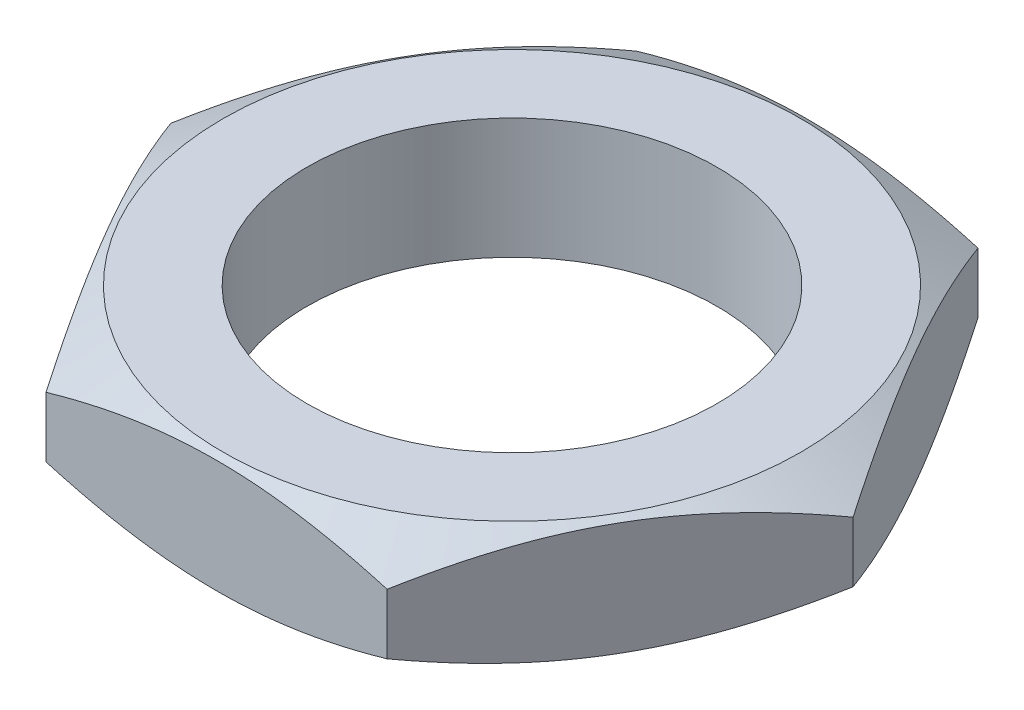
ISO-10303-21;
HEADER;
FILE_DESCRIPTION(('STEP AP214'),'2;1');
FILE_NAME('part.step','',(''),(''),'','','');
FILE_SCHEMA(('AUTOMOTIVE_DESIGN { 1 0 10303 214 1 1 1 1 }'));
ENDSEC;
DATA;
#1=APPLICATION_CONTEXT('core data for automotive mechanical design processes');
#2=APPLICATION_PROTOCOL_DEFINITION('international standard','automotive_design',2000,#1);
#3=PRODUCT_CONTEXT('',#1,'mechanical');
#4=PRODUCT('Part','Part','',(#3));
#5=PRODUCT_RELATED_PRODUCT_CATEGORY('part','',(#4));
#6=PRODUCT_DEFINITION_FORMATION('','',#4);
#7=PRODUCT_DEFINITION_CONTEXT('part definition',#1,'design');
#8=PRODUCT_DEFINITION('design','',#6,#7);
#9=PRODUCT_DEFINITION_SHAPE('','',#8);
#10=(LENGTH_UNIT() NAMED_UNIT(*) SI_UNIT(.MILLI.,.METRE.));
#11=(NAMED_UNIT(*) PLANE_ANGLE_UNIT() SI_UNIT($,.RADIAN.));
#12=(NAMED_UNIT(*) SI_UNIT($,.STERADIAN.) SOLID_ANGLE_UNIT());
#13=UNCERTAINTY_MEASURE_WITH_UNIT(LENGTH_MEASURE(1.E-05),#10,'distance_accuracy_value','');
#14=(GEOMETRIC_REPRESENTATION_CONTEXT(3) GLOBAL_UNCERTAINTY_ASSIGNED_CONTEXT((#13)) GLOBAL_UNIT_ASSIGNED_CONTEXT((#10,
#11,#12)) REPRESENTATION_CONTEXT('',''));
#15=CARTESIAN_POINT('',(0.,0.,0.));
#16=DIRECTION('',(0.,0.,1.));
#17=DIRECTION('',(1.,0.,0.));
#18=AXIS2_PLACEMENT_3D('',#15,#16,#17);
#19=CARTESIAN_POINT('',(0.,2.,0.));
#20=DIRECTION('',(0.,1.,0.));
#21=DIRECTION('',(0.,0.,1.));
#22=AXIS2_PLACEMENT_3D('',#19,#20,#21);
#23=PLANE('',#22);
#24=CARTESIAN_POINT('',(0.,2.,0.));
#25=DIRECTION('',(0.,1.,0.));
#26=DIRECTION('',(0.,0.,1.));
#27=AXIS2_PLACEMENT_3D('',#24,#25,#26);
#28=CIRCLE('',#27,3.4);
#29=CARTESIAN_POINT('',(0.,2.,3.4));
#30=VERTEX_POINT('',#29);
#31=EDGE_CURVE('E199',#30,#30,#28,.T.);
#32=ORIENTED_EDGE('',*,*,#31,.F.);
#33=EDGE_LOOP('',(#32));
#34=FACE_BOUND('',#33,.T.);
#35=CARTESIAN_POINT('',(0.,2.,0.));
#36=DIRECTION('',(0.,-1.,0.));
#37=DIRECTION('',(1.,0.,0.));
#38=AXIS2_PLACEMENT_3D('',#35,#36,#37);
#39=CIRCLE('',#38,4.79200723427386);
#40=CARTESIAN_POINT('',(4.79200723427391,2.00000000000002,0.));
#41=VERTEX_POINT('',#40);
#42=EDGE_CURVE('E221',#41,#41,#39,.T.);
#43=ORIENTED_EDGE('',*,*,#42,.F.);
#44=EDGE_LOOP('',(#43));
#45=FACE_BOUND('',#44,.T.);
#46=ADVANCED_FACE('F41',(#34,#45),#23,.T.);
#47=CARTESIAN_POINT('',(0.,0.,0.));
#48=DIRECTION('',(0.,1.,0.));
#49=DIRECTION('',(0.,0.,1.));
#50=AXIS2_PLACEMENT_3D('',#47,#48,#49);
#51=PLANE('',#50);
#52=CARTESIAN_POINT('',(0.,0.,0.));
#53=DIRECTION('',(0.,1.,0.));
#54=DIRECTION('',(0.,0.,1.));
#55=AXIS2_PLACEMENT_3D('',#52,#53,#54);
#56=CIRCLE('',#55,3.4);
#57=CARTESIAN_POINT('',(0.,0.,3.4));
#58=VERTEX_POINT('',#57);
#59=EDGE_CURVE('E198',#58,#58,#56,.T.);
#60=ORIENTED_EDGE('',*,*,#59,.T.);
#61=EDGE_LOOP('',(#60));
#62=FACE_BOUND('',#61,.T.);
#63=CARTESIAN_POINT('',(0.,0.,0.));
#64=DIRECTION('',(0.,-1.,0.));
#65=DIRECTION('',(1.,0.,0.));
#66=AXIS2_PLACEMENT_3D('',#63,#64,#65);
#67=CIRCLE('',#66,4.79200723427386);
#68=CARTESIAN_POINT('',(4.79200723427391,0.,0.));
#69=VERTEX_POINT('',#68);
#70=EDGE_CURVE('E225',#69,#69,#67,.T.);
#71=ORIENTED_EDGE('',*,*,#70,.T.);
#72=EDGE_LOOP('',(#71));
#73=FACE_BOUND('',#72,.T.);
#74=ADVANCED_FACE('F232',(#62,#73),#51,.F.);
#75=CARTESIAN_POINT('',(0.,2.,0.));
#76=DIRECTION('',(0.,-1.,0.));
#77=DIRECTION('',(0.,0.,-1.));
#78=AXIS2_PLACEMENT_3D('',#75,#76,#77);
#79=CYLINDRICAL_SURFACE('',#78,3.4);
#80=ORIENTED_EDGE('',*,*,#31,.T.);
#81=EDGE_LOOP('',(#80));
#82=FACE_BOUND('',#81,.T.);
#83=ORIENTED_EDGE('',*,*,#59,.F.);
#84=EDGE_LOOP('',(#83));
#85=FACE_BOUND('',#84,.T.);
#86=ADVANCED_FACE('F136',(#82,#85),#79,.F.);
#87=CARTESIAN_POINT('',(0.,0.499999999999945,0.));
#88=DIRECTION('',(0.,1.,0.));
#89=DIRECTION('',(-1.,0.,0.));
#90=AXIS2_PLACEMENT_3D('',#87,#88,#89);
#91=CONICAL_SURFACE('',#90,5.65803263805829,1.04719755119664);
#92=ORIENTED_EDGE('',*,*,#70,.F.);
#93=EDGE_LOOP('',(#92));
#94=FACE_BOUND('',#93,.T.);
#95=CARTESIAN_POINT('',(-8.50929847805935,2.90249437028564,4.90000000000009));
#96=CARTESIAN_POINT('',(-8.3056575233591,2.80062326429836,4.90000000000009));
#97=CARTESIAN_POINT('',(-8.10166143336671,2.69945462690032,4.90000000000008));
#98=CARTESIAN_POINT('',(-7.69279708503687,2.49886180214042,4.90000000000008));
#99=CARTESIAN_POINT('',(-7.48792876941672,2.39943773161803,4.90000000000008));
#100=CARTESIAN_POINT('',(-7.07677156335833,2.2024891002043,4.90000000000007));
#101=CARTESIAN_POINT('',(-6.87048064279863,2.1049687684786,4.90000000000007));
#102=CARTESIAN_POINT('',(-6.45670236813438,1.91250601420058,4.90000000000007));
#103=CARTESIAN_POINT('',(-6.24921503753413,1.81756354121223,4.90000000000007));
#104=CARTESIAN_POINT('',(-5.82343657037768,1.62664697676281,4.90000000000006));
#105=CARTESIAN_POINT('',(-5.60507970536397,1.53081898907332,4.90000000000006));
#106=CARTESIAN_POINT('',(-5.16650546915723,1.34352367776462,4.90000000000005));
#107=CARTESIAN_POINT('',(-4.94628816306703,1.25205620229502,4.90000000000005));
#108=CARTESIAN_POINT('',(-4.5037516917027,1.07470489275459,4.90000000000005));
#109=CARTESIAN_POINT('',(-4.28143382346245,0.988817841940205,4.90000000000005));
#110=CARTESIAN_POINT('',(-3.83420063309471,0.824129575926287,4.90000000000004));
#111=CARTESIAN_POINT('',(-3.60928559848315,0.745327584711642,4.90000000000004));
#112=CARTESIAN_POINT('',(-3.10342968689821,0.579390394495419,4.90000000000003));
#113=CARTESIAN_POINT('',(-2.82169998622153,0.494623454789728,4.90000000000003));
#114=CARTESIAN_POINT('',(-2.25315988093209,0.343704497905251,4.90000000000002));
#115=CARTESIAN_POINT('',(-1.9663499307873,0.277550824475047,4.90000000000002));
#116=CARTESIAN_POINT('',(-1.53518370342896,0.196928754869076,4.90000000000002));
#117=CARTESIAN_POINT('',(-1.39252811734528,0.173281527269368,4.90000000000002));
#118=CARTESIAN_POINT('',(-1.10630255219622,0.132453407262294,4.90000000000001));
#119=CARTESIAN_POINT('',(-0.962732708361694,0.115271580135958,4.90000000000001));
#120=CARTESIAN_POINT('',(-0.674965509769012,0.0878880755714065,4.90000000000001));
#121=CARTESIAN_POINT('',(-0.530768348406227,0.0776843817789623,4.90000000000001));
#122=CARTESIAN_POINT('',(-0.242039489102777,0.0645801081327594,4.9));
#123=CARTESIAN_POINT('',(-0.097507792588108,0.0616794972059309,4.9));
#124=CARTESIAN_POINT('',(0.192384920001188,0.06328493803544,4.9));
#125=CARTESIAN_POINT('',(0.337745687682987,0.0678357075999943,4.9));
#126=CARTESIAN_POINT('',(0.628047770239802,0.084273099695362,4.89999999999999));
#127=CARTESIAN_POINT('',(0.772989083248567,0.0961597548149582,4.89999999999999));
#128=CARTESIAN_POINT('',(1.06218179056766,0.126890386421764,4.89999999999999));
#129=CARTESIAN_POINT('',(1.20643290282158,0.145736995921202,4.89999999999999));
#130=CARTESIAN_POINT('',(1.49394518566744,0.189831947999736,4.89999999999999));
#131=CARTESIAN_POINT('',(1.63720632144198,0.215080514569869,4.89999999999998));
#132=CARTESIAN_POINT('',(2.07009477646272,0.300411853745416,4.89999999999998));
#133=CARTESIAN_POINT('',(2.35795556770022,0.369525417877549,4.89999999999998));
#134=CARTESIAN_POINT('',(2.9287007827471,0.525949721107696,4.89999999999997));
#135=CARTESIAN_POINT('',(3.21158230533385,0.613270711626837,4.89999999999997));
#136=CARTESIAN_POINT('',(3.71343353514693,0.781441814724652,4.89999999999996));
#137=CARTESIAN_POINT('',(3.9332663401682,0.85975427645491,4.89999999999996));
#138=CARTESIAN_POINT('',(4.37041278301648,1.02291056956414,4.89999999999996));
#139=CARTESIAN_POINT('',(4.5877270959115,1.10775260184943,4.89999999999995));
#140=CARTESIAN_POINT('',(5.02041296215908,1.282641205255,4.89999999999995));
#141=CARTESIAN_POINT('',(5.23578307857861,1.37269131115054,4.89999999999995));
#142=CARTESIAN_POINT('',(5.66477117180436,1.5568764137666,4.89999999999994));
#143=CARTESIAN_POINT('',(5.87838909287801,1.65101153982602,4.89999999999994));
#144=CARTESIAN_POINT('',(6.29514554365339,1.83849489924527,4.89999999999994));
#145=CARTESIAN_POINT('',(6.49834508088663,1.931707939353,4.89999999999993));
#146=CARTESIAN_POINT('',(6.9036004573576,2.12057545602201,4.89999999999993));
#147=CARTESIAN_POINT('',(7.10565631429502,2.21622989467312,4.89999999999993));
#148=CARTESIAN_POINT('',(7.50844571691837,2.4093733671581,4.89999999999992));
#149=CARTESIAN_POINT('',(7.70918097453281,2.50685883807706,4.89999999999992));
#150=CARTESIAN_POINT('',(8.10982411646701,2.7035024454122,4.89999999999992));
#151=CARTESIAN_POINT('',(8.30973202373609,2.80266053504018,4.89999999999991));
#152=CARTESIAN_POINT('',(8.50929847805945,2.90249437028565,4.89999999999991));
#153=B_SPLINE_CURVE_WITH_KNOTS('',3,(#95,#96,#97,#98,#99,#100,#101,#102,#103,#104,#105,#106,
#107,#108,#109,#110,#111,#112,#113,#114,#115,#116,#117,#118,#119,#120,#121,#122,#123,#124,#125,
#126,#127,#128,#129,#130,#131,#132,#133,#134,#135,#136,#137,#138,#139,#140,#141,#142,#143,#144,
#145,#146,#147,#148,#149,#150,#151,#152),.UNSPECIFIED.,.F.,.F.,(4,2,2,2,2,2,2,2,2,2,2,2,2,2,2,2,
2,2,2,2,2,2,2,2,2,2,2,2,4),(0.,0.683104072755931,1.36625372198822,2.05077931472942,
2.73529150500277,3.45063115840994,4.16594588261959,4.88084454878498,5.59566481762518,
6.47783684131721,7.35993034246223,7.79361357563099,8.22723408602896,8.66072924737596,
9.0942225642898,9.53032694279833,9.96643325866168,10.4027047266899,10.8389914610476,
11.7262258972984,12.6139612331911,13.3139353835799,14.0137173557322,14.7139799818105,
15.4142647956339,16.084923290998,16.7555713786693,17.4250274815205,18.0944648886146),.UNSPECIFIED.);
#154=CARTESIAN_POINT('',(-2.82901631902898,0.499999999999935,4.90000000000003));
#155=VERTEX_POINT('',#154);
#156=CARTESIAN_POINT('',(2.82901631902923,0.499999999999968,4.89999999999997));
#157=VERTEX_POINT('',#156);
#158=EDGE_CURVE('E56',#155,#157,#153,.T.);
#159=ORIENTED_EDGE('',*,*,#158,.F.);
#160=CARTESIAN_POINT('',(-5.65814810811218,0.500066668707423,-0.000199999999960545));
#161=CARTESIAN_POINT('',(-5.53382151838374,0.428269712536326,0.21513997014145));
#162=CARTESIAN_POINT('',(-5.40843156034933,0.362967055415012,0.432321748215975));
#163=CARTESIAN_POINT('',(-5.15548040936942,0.248980729712255,0.870445993546193));
#164=CARTESIAN_POINT('',(-5.02791472217963,0.20033738249348,1.09139624506135));
#165=CARTESIAN_POINT('',(-4.77434484352878,0.124630151443168,1.53059215815369));
#166=CARTESIAN_POINT('',(-4.64838014169528,0.0970619943998238,1.74876942168957));
#167=CARTESIAN_POINT('',(-4.45898998945309,0.072340869147508,2.07680278782624));
#168=CARTESIAN_POINT('',(-4.39581673421985,0.0668709779160111,2.18622207556972));
#169=CARTESIAN_POINT('',(-4.26941184065854,0.061567846662413,2.40516177354324));
#170=CARTESIAN_POINT('',(-4.20618020419414,0.0617344325358054,2.51468218054532));
#171=CARTESIAN_POINT('',(-4.03294288257485,0.0699480496401164,2.81473802335708));
#172=CARTESIAN_POINT('',(-3.92299459953095,0.0837426447185814,3.00517403579407));
#173=CARTESIAN_POINT('',(-3.70382774946254,0.127485480307362,3.38478215544738));
#174=CARTESIAN_POINT('',(-3.59460995281296,0.157448673828991,3.57395292833517));
#175=CARTESIAN_POINT('',(-3.37500152879443,0.232348992284918,3.95432587650538));
#176=CARTESIAN_POINT('',(-3.26463861791819,0.277603498259,4.14548004541422));
#177=CARTESIAN_POINT('',(-3.04555871027542,0.380313230199797,4.524937576369));
#178=CARTESIAN_POINT('',(-2.93683890736622,0.437744326847631,4.7132457987966));
#179=CARTESIAN_POINT('',(-2.82890084897528,0.500066668707418,4.90020000000003));
#180=B_SPLINE_CURVE_WITH_KNOTS('',3,(#160,#161,#162,#163,#164,#165,#166,#167,#168,#169,#170,
#171,#172,#173,#174,#175,#176,#177,#178,#179),.UNSPECIFIED.,.F.,.F.,(4,2,2,2,2,2,2,2,2,4),(0.,
0.77670504079433,1.55527690970039,2.31457999459248,2.69386501409238,3.07313831791074,
3.73343440743842,4.39434219988734,5.06990891293315,5.74414921983021),.UNSPECIFIED.);
#181=CARTESIAN_POINT('',(-5.65803263805824,0.499999999999926,2.09467859724199E-13));
#182=VERTEX_POINT('',#181);
#183=EDGE_CURVE('E145',#182,#155,#180,.T.);
#184=ORIENTED_EDGE('',*,*,#183,.F.);
#185=CARTESIAN_POINT('',(-2.82890084897535,0.500066668707419,-4.90019999999999));
#186=CARTESIAN_POINT('',(-2.95322743870378,0.428269712536321,-4.68486002985858));
#187=CARTESIAN_POINT('',(-3.07861739673819,0.362967055415008,-4.46767825178405));
#188=CARTESIAN_POINT('',(-3.33156854771809,0.248980729712252,-4.02955400645383));
#189=CARTESIAN_POINT('',(-3.45913423490788,0.200337382493478,-3.80860375493868));
#190=CARTESIAN_POINT('',(-3.71270411355872,0.124630151443167,-3.36940784184634));
#191=CARTESIAN_POINT('',(-3.83866881539222,0.0970619943998222,-3.15123057831045));
#192=CARTESIAN_POINT('',(-4.0280589676344,0.0723408691475071,-2.82319721217378));
#193=CARTESIAN_POINT('',(-4.09123222286764,0.0668709779160107,-2.7137779244303));
#194=CARTESIAN_POINT('',(-4.21763711642894,0.0615678466624131,-2.49483822645678));
#195=CARTESIAN_POINT('',(-4.28086875289335,0.0617344325358056,-2.3853178194547));
#196=CARTESIAN_POINT('',(-4.45410607451264,0.0699480496401172,-2.08526197664294));
#197=CARTESIAN_POINT('',(-4.56405435755653,0.083742644718583,-1.89482596420595));
#198=CARTESIAN_POINT('',(-4.78322120762494,0.127485480307364,-1.51521784455263));
#199=CARTESIAN_POINT('',(-4.89243900427451,0.157448673828993,-1.32604707166484));
#200=CARTESIAN_POINT('',(-5.11204742829304,0.23234899228492,-0.945674123494625));
#201=CARTESIAN_POINT('',(-5.22241033916927,0.277603498259003,-0.754519954585786));
#202=CARTESIAN_POINT('',(-5.44149024681205,0.380313230199801,-0.375062423630999));
#203=CARTESIAN_POINT('',(-5.55021004972124,0.437744326847635,-0.186754201203398));
#204=CARTESIAN_POINT('',(-5.65814810811217,0.500066668707423,0.000200000000039495));
#205=B_SPLINE_CURVE_WITH_KNOTS('',3,(#185,#186,#187,#188,#189,#190,#191,#192,#193,#194,#195,
#196,#197,#198,#199,#200,#201,#202,#203,#204),.UNSPECIFIED.,.F.,.F.,(4,2,2,2,2,2,2,2,2,4),(0.,
0.776705040794326,1.55527690970038,2.31457999459248,2.69386501409237,3.07313831791072,
3.73343440743841,4.39434219988734,5.06990891293315,5.74414921983021),.UNSPECIFIED.);
#206=CARTESIAN_POINT('',(-2.82901631902926,0.499999999999935,-4.89999999999986));
#207=VERTEX_POINT('',#206);
#208=EDGE_CURVE('E153',#207,#182,#205,.T.);
#209=ORIENTED_EDGE('',*,*,#208,.F.);
#210=CARTESIAN_POINT('',(8.50929847805938,2.90249437028565,-4.90000000000003));
#211=CARTESIAN_POINT('',(8.30565752335914,2.80062326429837,-4.90000000000003));
#212=CARTESIAN_POINT('',(8.10166143336675,2.69945462690033,-4.90000000000003));
#213=CARTESIAN_POINT('',(7.69279708503691,2.49886180214043,-4.90000000000003));
#214=CARTESIAN_POINT('',(7.48792876941676,2.39943773161804,-4.90000000000003));
#215=CARTESIAN_POINT('',(7.07677156335838,2.20248910020431,-4.90000000000003));
#216=CARTESIAN_POINT('',(6.87048064279868,2.10496876847861,-4.90000000000003));
#217=CARTESIAN_POINT('',(6.45670236813443,1.91250601420059,-4.90000000000002));
#218=CARTESIAN_POINT('',(6.24921503753418,1.81756354121225,-4.90000000000002));
#219=CARTESIAN_POINT('',(5.82343657037774,1.62664697676282,-4.90000000000002));
#220=CARTESIAN_POINT('',(5.60507970536403,1.53081898907333,-4.90000000000002));
#221=CARTESIAN_POINT('',(5.1665054691573,1.34352367776463,-4.90000000000002));
#222=CARTESIAN_POINT('',(4.9462881630671,1.25205620229503,-4.90000000000002));
#223=CARTESIAN_POINT('',(4.50375169170277,1.0747048927546,-4.90000000000002));
#224=CARTESIAN_POINT('',(4.28143382346253,0.988817841940215,-4.90000000000002));
#225=CARTESIAN_POINT('',(3.83420063309479,0.824129575926295,-4.90000000000001));
#226=CARTESIAN_POINT('',(3.60928559848323,0.745327584711651,-4.90000000000001));
#227=CARTESIAN_POINT('',(3.1034296868983,0.579390394495426,-4.90000000000001));
#228=CARTESIAN_POINT('',(2.82169998622161,0.494623454789734,-4.90000000000001));
#229=CARTESIAN_POINT('',(2.25315988093218,0.343704497905256,-4.90000000000001));
#230=CARTESIAN_POINT('',(1.96634993078739,0.277550824475052,-4.90000000000001));
#231=CARTESIAN_POINT('',(1.53518370342906,0.19692875486908,-4.90000000000001));
#232=CARTESIAN_POINT('',(1.39252811734538,0.173281527269372,-4.90000000000001));
#233=CARTESIAN_POINT('',(1.10630255219632,0.132453407262297,-4.9));
#234=CARTESIAN_POINT('',(0.962732708361791,0.115271580135961,-4.9));
#235=CARTESIAN_POINT('',(0.674965509769109,0.0878880755714087,-4.9));
#236=CARTESIAN_POINT('',(0.530768348406324,0.0776843817789642,-4.9));
#237=CARTESIAN_POINT('',(0.242039489102876,0.0645801081327607,-4.9));
#238=CARTESIAN_POINT('',(0.0975077925882073,0.0616794972059317,-4.9));
#239=CARTESIAN_POINT('',(-0.192384920001088,0.06328493803544,-4.9));
#240=CARTESIAN_POINT('',(-0.337745687682886,0.0678357075999939,-4.9));
#241=CARTESIAN_POINT('',(-0.628047770239699,0.0842730996953606,-4.9));
#242=CARTESIAN_POINT('',(-0.772989083248464,0.0961597548149561,-4.9));
#243=CARTESIAN_POINT('',(-1.06218179056755,0.126890386421761,-4.9));
#244=CARTESIAN_POINT('',(-1.20643290282147,0.145736995921199,-4.9));
#245=CARTESIAN_POINT('',(-1.49394518566733,0.189831947999732,-4.9));
#246=CARTESIAN_POINT('',(-1.63720632144187,0.215080514569864,-4.9));
#247=CARTESIAN_POINT('',(-2.07009477646262,0.300411853745408,-4.9));
#248=CARTESIAN_POINT('',(-2.35795556770011,0.369525417877539,-4.89999999999999));
#249=CARTESIAN_POINT('',(-2.92870078274699,0.525949721107683,-4.89999999999999));
#250=CARTESIAN_POINT('',(-3.21158230533374,0.613270711626822,-4.89999999999999));
#251=CARTESIAN_POINT('',(-3.71343353514682,0.781441814724634,-4.89999999999999));
#252=CARTESIAN_POINT('',(-3.93326634016809,0.859754276454892,-4.89999999999999));
#253=CARTESIAN_POINT('',(-4.37041278301638,1.02291056956412,-4.89999999999999));
#254=CARTESIAN_POINT('',(-4.5877270959114,1.10775260184942,-4.89999999999999));
#255=CARTESIAN_POINT('',(-5.02041296215899,1.28264120525498,-4.89999999999998));
#256=CARTESIAN_POINT('',(-5.23578307857852,1.37269131115053,-4.89999999999998));
#257=CARTESIAN_POINT('',(-5.66477117180428,1.55687641376658,-4.89999999999998));
#258=CARTESIAN_POINT('',(-5.87838909287793,1.651011539826,-4.89999999999998));
#259=CARTESIAN_POINT('',(-6.29514554365332,1.83849489924525,-4.89999999999998));
#260=CARTESIAN_POINT('',(-6.49834508088656,1.93170793935298,-4.89999999999998));
#261=CARTESIAN_POINT('',(-6.90360045735754,2.12057545602199,-4.89999999999998));
#262=CARTESIAN_POINT('',(-7.10565631429496,2.21622989467311,-4.89999999999998));
#263=CARTESIAN_POINT('',(-7.50844571691832,2.40937336715809,-4.89999999999998));
#264=CARTESIAN_POINT('',(-7.70918097453276,2.50685883807704,-4.89999999999998));
#265=CARTESIAN_POINT('',(-8.10982411646697,2.70350244541218,-4.89999999999997));
#266=CARTESIAN_POINT('',(-8.30973202373605,2.80266053504017,-4.89999999999997));
#267=CARTESIAN_POINT('',(-8.50929847805942,2.90249437028564,-4.89999999999997));
#268=B_SPLINE_CURVE_WITH_KNOTS('',3,(#210,#211,#212,#213,#214,#215,#216,#217,#218,#219,#220,
#221,#222,#223,#224,#225,#226,#227,#228,#229,#230,#231,#232,#233,#234,#235,#236,#237,#238,#239,
#240,#241,#242,#243,#244,#245,#246,#247,#248,#249,#250,#251,#252,#253,#254,#255,#256,#257,#258,
#259,#260,#261,#262,#263,#264,#265,#266,#267),.UNSPECIFIED.,.F.,.F.,(4,2,2,2,2,2,2,2,2,2,2,2,2,
2,2,2,2,2,2,2,2,2,2,2,2,2,2,2,4),(0.,0.683104072755927,1.36625372198821,2.05077931472941,
2.73529150500275,3.45063115840991,4.16594588261956,4.88084454878493,5.59566481762514,
6.47783684131716,7.35993034246217,7.79361357563093,8.22723408602891,8.6607292473759,
9.09422256428974,9.53032694279827,9.96643325866162,10.4027047266898,10.8389914610475,
11.7262258972983,12.6139612331911,13.3139353835798,14.0137173557321,14.7139799818105,
15.4142647956339,16.084923290998,16.7555713786693,17.4250274815205,18.0944648886146),.UNSPECIFIED.);
#269=CARTESIAN_POINT('',(2.82901631902911,0.499999999999955,-4.90000000000001));
#270=VERTEX_POINT('',#269);
#271=EDGE_CURVE('E101',#270,#207,#268,.T.);
#272=ORIENTED_EDGE('',*,*,#271,.F.);
#273=CARTESIAN_POINT('',(5.65814810811218,0.500066668707406,0.000200000000000053));
#274=CARTESIAN_POINT('',(5.53382151838375,0.428269712536307,-0.215139970141408));
#275=CARTESIAN_POINT('',(5.40843156034934,0.362967055414994,-0.43232174821593));
#276=CARTESIAN_POINT('',(5.15548040936944,0.248980729712237,-0.870445993546141));
#277=CARTESIAN_POINT('',(5.02791472217965,0.200337382493463,-1.09139624506129));
#278=CARTESIAN_POINT('',(4.77434484352881,0.12463015144315,-1.53059215815363));
#279=CARTESIAN_POINT('',(4.64838014169531,0.0970619943998039,-1.74876942168951));
#280=CARTESIAN_POINT('',(4.45898998945313,0.0723408691474874,-2.07680278782618));
#281=CARTESIAN_POINT('',(4.39581673421989,0.0668709779159907,-2.18622207556965));
#282=CARTESIAN_POINT('',(4.26941184065859,0.0615678466623921,-2.40516177354317));
#283=CARTESIAN_POINT('',(4.20618020419418,0.0617344325357839,-2.51468218054525));
#284=CARTESIAN_POINT('',(4.03294288257489,0.0699480496400936,-2.814738023357));
#285=CARTESIAN_POINT('',(3.92299459953099,0.0837426447185585,-3.005174035794));
#286=CARTESIAN_POINT('',(3.70382774946258,0.12748548030734,-3.38478215544732));
#287=CARTESIAN_POINT('',(3.594609952813,0.15744867382897,-3.57395292833512));
#288=CARTESIAN_POINT('',(3.37500152879447,0.2323489922849,-3.95432587650533));
#289=CARTESIAN_POINT('',(3.26463861791823,0.277603498258983,-4.14548004541418));
#290=CARTESIAN_POINT('',(3.04555871027545,0.380313230199783,-4.52493757636897));
#291=CARTESIAN_POINT('',(2.93683890736626,0.437744326847619,-4.71324579879657));
#292=CARTESIAN_POINT('',(2.82890084897532,0.50006666870741,-4.90020000000001));
#293=B_SPLINE_CURVE_WITH_KNOTS('',3,(#273,#274,#275,#276,#277,#278,#279,#280,#281,#282,#283,
#284,#285,#286,#287,#288,#289,#290,#291,#292),.UNSPECIFIED.,.F.,.F.,(4,2,2,2,2,2,2,2,2,4),(0.,
0.776705040794316,1.55527690970036,2.31457999459244,2.69386501409234,3.07313831791068,
3.73343440743838,4.39434219988731,5.06990891293314,5.74414921983022),.UNSPECIFIED.);
#294=CARTESIAN_POINT('',(5.65803263805834,0.499999999999964,0.));
#295=VERTEX_POINT('',#294);
#296=EDGE_CURVE('E98',#295,#270,#293,.T.);
#297=ORIENTED_EDGE('',*,*,#296,.F.);
#298=CARTESIAN_POINT('',(2.82890084897539,0.50006666870741,4.90019999999997));
#299=CARTESIAN_POINT('',(2.95322743870382,0.428269712536312,4.68486002985856));
#300=CARTESIAN_POINT('',(3.07861739673822,0.362967055414999,4.46767825178404));
#301=CARTESIAN_POINT('',(3.33156854771812,0.248980729712243,4.02955400645382));
#302=CARTESIAN_POINT('',(3.45913423490791,0.200337382493469,3.80860375493867));
#303=CARTESIAN_POINT('',(3.71270411355875,0.124630151443158,3.36940784184633));
#304=CARTESIAN_POINT('',(3.83866881539225,0.0970619943998129,3.15123057831045));
#305=CARTESIAN_POINT('',(4.02805896763443,0.0723408691474974,2.82319721217378));
#306=CARTESIAN_POINT('',(4.09123222286766,0.0668709779160008,2.7137779244303));
#307=CARTESIAN_POINT('',(4.21763711642896,0.0615678466624029,2.49483822645678));
#308=CARTESIAN_POINT('',(4.28086875289337,0.0617344325357953,2.3853178194547));
#309=CARTESIAN_POINT('',(4.45410607451266,0.069948049640106,2.08526197664295));
#310=CARTESIAN_POINT('',(4.56405435755655,0.0837426447185706,1.89482596420596));
#311=CARTESIAN_POINT('',(4.78322120762495,0.127485480307351,1.51521784455265));
#312=CARTESIAN_POINT('',(4.89243900427453,0.15744867382898,1.32604707166486));
#313=CARTESIAN_POINT('',(5.11204742829305,0.232348992284907,0.94567412349465));
#314=CARTESIAN_POINT('',(5.22241033916928,0.277603498258988,0.754519954585814));
#315=CARTESIAN_POINT('',(5.44149024681205,0.380313230199784,0.375062423631032));
#316=CARTESIAN_POINT('',(5.55021004972124,0.437744326847618,0.186754201203435));
#317=CARTESIAN_POINT('',(5.65814810811218,0.500066668707405,-0.000199999999999379));
#318=B_SPLINE_CURVE_WITH_KNOTS('',3,(#298,#299,#300,#301,#302,#303,#304,#305,#306,#307,#308,
#309,#310,#311,#312,#313,#314,#315,#316,#317),.UNSPECIFIED.,.F.,.F.,(4,2,2,2,2,2,2,2,2,4),(0.,
0.776705040794319,1.55527690970037,2.31457999459245,2.69386501409235,3.0731383179107,
3.73343440743837,4.39434219988729,5.06990891293309,5.74414921983014),.UNSPECIFIED.);
#319=EDGE_CURVE('E70',#157,#295,#318,.T.);
#320=ORIENTED_EDGE('',*,*,#319,.F.);
#321=EDGE_LOOP('',(#159,#184,#209,#272,#297,#320));
#322=FACE_BOUND('',#321,.T.);
#323=ADVANCED_FACE('F99',(#94,#322),#91,.T.);
#324=CARTESIAN_POINT('',(0.,2.,0.));
#325=DIRECTION('',(0.,-1.,0.));
#326=DIRECTION('',(1.,0.,0.));
#327=AXIS2_PLACEMENT_3D('',#324,#325,#326);
#328=CONICAL_SURFACE('',#327,4.79200723427386,1.04719755119664);
#329=ORIENTED_EDGE('',*,*,#42,.T.);
#330=EDGE_LOOP('',(#329));
#331=FACE_BOUND('',#330,.T.);
#332=CARTESIAN_POINT('',(2.82890084897532,1.49993333129261,-4.90020000000001));
#333=CARTESIAN_POINT('',(2.95322743870375,1.57173028746371,-4.6848600298586));
#334=CARTESIAN_POINT('',(3.07861739673816,1.63703294458503,-4.46767825178408));
#335=CARTESIAN_POINT('',(3.33156854771806,1.75101927028779,-4.02955400645387));
#336=CARTESIAN_POINT('',(3.45913423490785,1.79966261750656,-3.80860375493871));
#337=CARTESIAN_POINT('',(3.71270411355869,1.87536984855688,-3.36940784184638));
#338=CARTESIAN_POINT('',(3.83866881539219,1.90293800560022,-3.1512305783105));
#339=CARTESIAN_POINT('',(4.02805896763437,1.92765913085254,-2.82319721217383));
#340=CARTESIAN_POINT('',(4.09123222286761,1.93312902208404,-2.71377792443035));
#341=CARTESIAN_POINT('',(4.21763711642891,1.93843215333764,-2.49483822645683));
#342=CARTESIAN_POINT('',(4.28086875289332,1.93826556746425,-2.38531781945475));
#343=CARTESIAN_POINT('',(4.45410607451261,1.93005195035994,-2.08526197664299));
#344=CARTESIAN_POINT('',(4.56405435755651,1.91625735528148,-1.894825964206));
#345=CARTESIAN_POINT('',(4.78322120762492,1.8725145196927,-1.51521784455268));
#346=CARTESIAN_POINT('',(4.8924390042745,1.84255132617107,-1.32604707166489));
#347=CARTESIAN_POINT('',(5.11204742829302,1.76765100771514,-0.945674123494672));
#348=CARTESIAN_POINT('',(5.22241033916926,1.72239650174106,-0.754519954585831));
#349=CARTESIAN_POINT('',(5.44149024681204,1.61968676980026,-0.375062423631041));
#350=CARTESIAN_POINT('',(5.55021004972124,1.56225567315242,-0.186754201203439));
#351=CARTESIAN_POINT('',(5.65814810811218,1.49993333129263,0.000199999999999985));
#352=B_SPLINE_CURVE_WITH_KNOTS('',3,(#332,#333,#334,#335,#336,#337,#338,#339,#340,#341,#342,
#343,#344,#345,#346,#347,#348,#349,#350,#351),.UNSPECIFIED.,.F.,.F.,(4,2,2,2,2,2,2,2,2,4),(0.,
0.776705040794319,1.55527690970037,2.31457999459246,2.69386501409235,3.0731383179107,
3.73343440743839,4.39434219988732,5.06990891293315,5.74414921983022),.UNSPECIFIED.);
#353=CARTESIAN_POINT('',(2.82901631902911,1.50000000000007,-4.90000000000001));
#354=VERTEX_POINT('',#353);
#355=CARTESIAN_POINT('',(5.65803263805834,1.50000000000008,0.));
#356=VERTEX_POINT('',#355);
#357=EDGE_CURVE('E117',#354,#356,#352,.T.);
#358=ORIENTED_EDGE('',*,*,#357,.F.);
#359=CARTESIAN_POINT('',(-8.50929847805941,-0.902494370285708,-4.89999999999997));
#360=CARTESIAN_POINT('',(-8.30565752335917,-0.800623264298427,-4.89999999999997));
#361=CARTESIAN_POINT('',(-8.10166143336678,-0.699454626900385,-4.89999999999997));
#362=CARTESIAN_POINT('',(-7.69279708503694,-0.498861802140479,-4.89999999999998));
#363=CARTESIAN_POINT('',(-7.48792876941679,-0.399437731618094,-4.89999999999998));
#364=CARTESIAN_POINT('',(-7.07677156335841,-0.20248910020436,-4.89999999999998));
#365=CARTESIAN_POINT('',(-6.87048064279871,-0.104968768478655,-4.89999999999998));
#366=CARTESIAN_POINT('',(-6.45670236813446,0.0874939857993655,-4.89999999999998));
#367=CARTESIAN_POINT('',(-6.24921503753421,0.182436458787713,-4.89999999999998));
#368=CARTESIAN_POINT('',(-5.82343657037776,0.373353023237137,-4.89999999999998));
#369=CARTESIAN_POINT('',(-5.60507970536405,0.46918101092663,-4.89999999999998));
#370=CARTESIAN_POINT('',(-5.16650546915732,0.656476322235336,-4.89999999999998));
#371=CARTESIAN_POINT('',(-4.94628816306712,0.747943797704936,-4.89999999999999));
#372=CARTESIAN_POINT('',(-4.50375169170279,0.925295107245368,-4.89999999999999));
#373=CARTESIAN_POINT('',(-4.28143382346255,1.01118215805976,-4.89999999999999));
#374=CARTESIAN_POINT('',(-3.83420063309481,1.17587042407368,-4.89999999999999));
#375=CARTESIAN_POINT('',(-3.60928559848324,1.25467241528833,-4.89999999999999));
#376=CARTESIAN_POINT('',(-3.10342968689831,1.42060960550455,-4.89999999999999));
#377=CARTESIAN_POINT('',(-2.82169998622163,1.50537654521025,-4.89999999999999));
#378=CARTESIAN_POINT('',(-2.25315988093219,1.65629550209473,-4.89999999999999));
#379=CARTESIAN_POINT('',(-1.9663499307874,1.72244917552494,-4.9));
#380=CARTESIAN_POINT('',(-1.53518370342907,1.80307124513091,-4.9));
#381=CARTESIAN_POINT('',(-1.39252811734539,1.82671847273062,-4.9));
#382=CARTESIAN_POINT('',(-1.10630255219633,1.8675465927377,-4.9));
#383=CARTESIAN_POINT('',(-0.962732708361805,1.88472841986404,-4.9));
#384=CARTESIAN_POINT('',(-0.674965509769123,1.91211192442859,-4.9));
#385=CARTESIAN_POINT('',(-0.530768348406338,1.92231561822104,-4.9));
#386=CARTESIAN_POINT('',(-0.24203948910289,1.93541989186724,-4.9));
#387=CARTESIAN_POINT('',(-0.0975077925882216,1.93832050279407,-4.9));
#388=CARTESIAN_POINT('',(0.192384920001073,1.93671506196457,-4.9));
#389=CARTESIAN_POINT('',(0.337745687682871,1.93216429240001,-4.9));
#390=CARTESIAN_POINT('',(0.628047770239685,1.91572690030465,-4.9));
#391=CARTESIAN_POINT('',(0.77298908324845,1.90384024518506,-4.9));
#392=CARTESIAN_POINT('',(1.06218179056754,1.87310961357825,-4.9));
#393=CARTESIAN_POINT('',(1.20643290282146,1.85426300407882,-4.90000000000001));
#394=CARTESIAN_POINT('',(1.49394518566732,1.81016805200029,-4.90000000000001));
#395=CARTESIAN_POINT('',(1.63720632144186,1.78491948543015,-4.90000000000001));
#396=CARTESIAN_POINT('',(2.07009477646261,1.69958814625461,-4.90000000000001));
#397=CARTESIAN_POINT('',(2.3579555677001,1.63047458212248,-4.90000000000001));
#398=CARTESIAN_POINT('',(2.92870078274698,1.47405027889234,-4.90000000000001));
#399=CARTESIAN_POINT('',(3.21158230533373,1.3867292883732,-4.90000000000001));
#400=CARTESIAN_POINT('',(3.71343353514682,1.21855818527539,-4.90000000000001));
#401=CARTESIAN_POINT('',(3.93326634016808,1.14024572354514,-4.90000000000001));
#402=CARTESIAN_POINT('',(4.37041278301637,0.977089430435905,-4.90000000000002));
#403=CARTESIAN_POINT('',(4.58772709591139,0.892247398150615,-4.90000000000002));
#404=CARTESIAN_POINT('',(5.02041296215897,0.717358794745052,-4.90000000000002));
#405=CARTESIAN_POINT('',(5.23578307857851,0.627308688849507,-4.90000000000002));
#406=CARTESIAN_POINT('',(5.66477117180426,0.443123586233456,-4.90000000000002));
#407=CARTESIAN_POINT('',(5.87838909287791,0.348988460174032,-4.90000000000002));
#408=CARTESIAN_POINT('',(6.2951455436533,0.161505100754787,-4.90000000000002));
#409=CARTESIAN_POINT('',(6.49834508088654,0.0682920606470567,-4.90000000000002));
#410=CARTESIAN_POINT('',(6.90360045735752,-0.120575456021954,-4.90000000000003));
#411=CARTESIAN_POINT('',(7.10565631429494,-0.216229894673067,-4.90000000000003));
#412=CARTESIAN_POINT('',(7.50844571691829,-0.409373367158046,-4.90000000000003));
#413=CARTESIAN_POINT('',(7.70918097453273,-0.506858838077,-4.90000000000003));
#414=CARTESIAN_POINT('',(8.10982411646694,-0.703502445412138,-4.90000000000003));
#415=CARTESIAN_POINT('',(8.30973202373602,-0.802660535040121,-4.90000000000003));
#416=CARTESIAN_POINT('',(8.50929847805938,-0.902494370285594,-4.90000000000003));
#417=B_SPLINE_CURVE_WITH_KNOTS('',3,(#359,#360,#361,#362,#363,#364,#365,#366,#367,#368,#369,
#370,#371,#372,#373,#374,#375,#376,#377,#378,#379,#380,#381,#382,#383,#384,#385,#386,#387,#388,
#389,#390,#391,#392,#393,#394,#395,#396,#397,#398,#399,#400,#401,#402,#403,#404,#405,#406,#407,
#408,#409,#410,#411,#412,#413,#414,#415,#416),.UNSPECIFIED.,.F.,.F.,(4,2,2,2,2,2,2,2,2,2,2,2,2,
2,2,2,2,2,2,2,2,2,2,2,2,2,2,2,4),(0.,0.68310407275593,1.36625372198822,2.05077931472941,
2.73529150500276,3.45063115840992,4.16594588261958,4.88084454878496,5.59566481762517,
6.47783684131719,7.3599303424622,7.79361357563097,8.22723408602894,8.66072924737594,
9.09422256428977,9.5303269427983,9.96643325866165,10.4027047266898,10.8389914610476,
11.7262258972984,12.6139612331911,13.3139353835799,14.0137173557322,14.7139799818105,
15.4142647956339,16.084923290998,16.7555713786693,17.4250274815205,18.0944648886146),.UNSPECIFIED.);
#418=CARTESIAN_POINT('',(-2.82901631902926,1.50000000000005,-4.89999999999987));
#419=VERTEX_POINT('',#418);
#420=EDGE_CURVE('E187',#419,#354,#417,.T.);
#421=ORIENTED_EDGE('',*,*,#420,.F.);
#422=CARTESIAN_POINT('',(-5.65814810811217,1.49993333129254,0.00020000000003951));
#423=CARTESIAN_POINT('',(-5.53382151838375,1.57173028746364,-0.215139970141373));
#424=CARTESIAN_POINT('',(-5.40843156034934,1.63703294458496,-0.4323217482159));
#425=CARTESIAN_POINT('',(-5.15548040936944,1.75101927028772,-0.870445993546121));
#426=CARTESIAN_POINT('',(-5.02791472217965,1.79966261750649,-1.09139624506128));
#427=CARTESIAN_POINT('',(-4.7743448435288,1.87536984855681,-1.53059215815362));
#428=CARTESIAN_POINT('',(-4.64838014169531,1.90293800560015,-1.7487694216895));
#429=CARTESIAN_POINT('',(-4.45898998945312,1.92765913085247,-2.07680278782618));
#430=CARTESIAN_POINT('',(-4.39581673421989,1.93312902208397,-2.18622207556966));
#431=CARTESIAN_POINT('',(-4.26941184065858,1.93843215333757,-2.40516177354318));
#432=CARTESIAN_POINT('',(-4.20618020419417,1.93826556746417,-2.51468218054526));
#433=CARTESIAN_POINT('',(-4.03294288257489,1.93005195035986,-2.81473802335702));
#434=CARTESIAN_POINT('',(-3.92299459953099,1.9162573552814,-3.00517403579401));
#435=CARTESIAN_POINT('',(-3.70382774946258,1.87251451969262,-3.38478215544733));
#436=CARTESIAN_POINT('',(-3.59460995281301,1.84255132617099,-3.57395292833512));
#437=CARTESIAN_POINT('',(-3.37500152879449,1.76765100771507,-3.95432587650533));
#438=CARTESIAN_POINT('',(-3.26463861791825,1.72239650174098,-4.14548004541417));
#439=CARTESIAN_POINT('',(-3.04555871027548,1.61968676980019,-4.52493757636895));
#440=CARTESIAN_POINT('',(-2.93683890736629,1.56225567315235,-4.71324579879655));
#441=CARTESIAN_POINT('',(-2.82890084897535,1.49993333129257,-4.90019999999999));
#442=B_SPLINE_CURVE_WITH_KNOTS('',3,(#422,#423,#424,#425,#426,#427,#428,#429,#430,#431,#432,
#433,#434,#435,#436,#437,#438,#439,#440,#441),.UNSPECIFIED.,.F.,.F.,(4,2,2,2,2,2,2,2,2,4),(0.,
0.77670504079433,1.55527690970039,2.31457999459248,2.69386501409238,3.07313831791074,
3.73343440743842,4.39434219988734,5.06990891293315,5.74414921983022),.UNSPECIFIED.);
#443=CARTESIAN_POINT('',(-5.65803263805825,1.50000000000004,1.9819215713035E-13));
#444=VERTEX_POINT('',#443);
#445=EDGE_CURVE('E217',#444,#419,#442,.T.);
#446=ORIENTED_EDGE('',*,*,#445,.F.);
#447=CARTESIAN_POINT('',(-2.82890084897528,1.49993333129257,4.90020000000003));
#448=CARTESIAN_POINT('',(-2.95322743870372,1.57173028746366,4.68486002985862));
#449=CARTESIAN_POINT('',(-3.07861739673813,1.63703294458498,4.4676782517841));
#450=CARTESIAN_POINT('',(-3.33156854771803,1.75101927028773,4.02955400645388));
#451=CARTESIAN_POINT('',(-3.45913423490783,1.79966261750651,3.80860375493873));
#452=CARTESIAN_POINT('',(-3.71270411355867,1.87536984855682,3.36940784184639));
#453=CARTESIAN_POINT('',(-3.83866881539218,1.90293800560016,3.1512305783105));
#454=CARTESIAN_POINT('',(-4.02805896763437,1.92765913085247,2.82319721217383));
#455=CARTESIAN_POINT('',(-4.0912322228676,1.93312902208397,2.71377792443035));
#456=CARTESIAN_POINT('',(-4.21763711642891,1.93843215333757,2.49483822645684));
#457=CARTESIAN_POINT('',(-4.28086875289332,1.93826556746417,2.38531781945476));
#458=CARTESIAN_POINT('',(-4.45410607451261,1.93005195035986,2.085261976643));
#459=CARTESIAN_POINT('',(-4.56405435755651,1.9162573552814,1.89482596420601));
#460=CARTESIAN_POINT('',(-4.78322120762492,1.87251451969261,1.5152178445527));
#461=CARTESIAN_POINT('',(-4.8924390042745,1.84255132617098,1.32604707166491));
#462=CARTESIAN_POINT('',(-5.11204742829302,1.76765100771505,0.945674123494696));
#463=CARTESIAN_POINT('',(-5.22241033916926,1.72239650174097,0.754519954585858));
#464=CARTESIAN_POINT('',(-5.44149024681204,1.61968676980017,0.375062423631075));
#465=CARTESIAN_POINT('',(-5.55021004972124,1.56225567315233,0.186754201203475));
#466=CARTESIAN_POINT('',(-5.65814810811218,1.49993333129254,-0.000199999999960646));
#467=B_SPLINE_CURVE_WITH_KNOTS('',3,(#447,#448,#449,#450,#451,#452,#453,#454,#455,#456,#457,
#458,#459,#460,#461,#462,#463,#464,#465,#466),.UNSPECIFIED.,.F.,.F.,(4,2,2,2,2,2,2,2,2,4),(0.,
0.776705040794327,1.55527690970038,2.31457999459248,2.69386501409237,3.07313831791072,
3.73343440743841,4.39434219988734,5.06990891293315,5.74414921983021),.UNSPECIFIED.);
#468=CARTESIAN_POINT('',(-2.82901631902912,1.50000000000001,4.90000000000003));
#469=VERTEX_POINT('',#468);
#470=EDGE_CURVE('E63',#469,#444,#467,.T.);
#471=ORIENTED_EDGE('',*,*,#470,.F.);
#472=CARTESIAN_POINT('',(8.50929847805945,-0.902494370285595,4.89999999999991));
#473=CARTESIAN_POINT('',(8.3056575233592,-0.800623264298316,4.89999999999992));
#474=CARTESIAN_POINT('',(8.10166143336682,-0.699454626900277,4.89999999999992));
#475=CARTESIAN_POINT('',(7.69279708503698,-0.498861802140377,4.89999999999992));
#476=CARTESIAN_POINT('',(7.48792876941683,-0.399437731617995,4.89999999999992));
#477=CARTESIAN_POINT('',(7.07677156335845,-0.202489100204267,4.89999999999993));
#478=CARTESIAN_POINT('',(6.87048064279875,-0.104968768478564,4.89999999999993));
#479=CARTESIAN_POINT('',(6.45670236813451,0.0874939857994515,4.89999999999993));
#480=CARTESIAN_POINT('',(6.24921503753425,0.182436458787796,4.89999999999994));
#481=CARTESIAN_POINT('',(5.82343657037781,0.373353023237215,4.89999999999994));
#482=CARTESIAN_POINT('',(5.6050797053641,0.469181010926705,4.89999999999994));
#483=CARTESIAN_POINT('',(5.16650546915737,0.656476322235404,4.89999999999995));
#484=CARTESIAN_POINT('',(4.94628816306718,0.747943797705001,4.89999999999995));
#485=CARTESIAN_POINT('',(4.50375169170285,0.925295107245427,4.89999999999995));
#486=CARTESIAN_POINT('',(4.28143382346261,1.01118215805981,4.89999999999996));
#487=CARTESIAN_POINT('',(3.83420063309487,1.17587042407373,4.89999999999996));
#488=CARTESIAN_POINT('',(3.60928559848331,1.25467241528837,4.89999999999996));
#489=CARTESIAN_POINT('',(3.10342968689838,1.42060960550459,4.89999999999997));
#490=CARTESIAN_POINT('',(2.8216999862217,1.50537654521028,4.89999999999997));
#491=CARTESIAN_POINT('',(2.25315988093226,1.65629550209476,4.89999999999998));
#492=CARTESIAN_POINT('',(1.96634993078747,1.72244917552496,4.89999999999998));
#493=CARTESIAN_POINT('',(1.53518370342914,1.80307124513093,4.89999999999999));
#494=CARTESIAN_POINT('',(1.39252811734547,1.82671847273064,4.89999999999999));
#495=CARTESIAN_POINT('',(1.1063025521964,1.86754659273771,4.89999999999999));
#496=CARTESIAN_POINT('',(0.962732708361879,1.88472841986405,4.89999999999999));
#497=CARTESIAN_POINT('',(0.674965509769198,1.9121119244286,4.89999999999999));
#498=CARTESIAN_POINT('',(0.530768348406414,1.92231561822104,4.9));
#499=CARTESIAN_POINT('',(0.242039489102966,1.93541989186725,4.9));
#500=CARTESIAN_POINT('',(0.0975077925882978,1.93832050279407,4.9));
#501=CARTESIAN_POINT('',(-0.192384920000996,1.93671506196457,4.9));
#502=CARTESIAN_POINT('',(-0.337745687682794,1.93216429240001,4.9));
#503=CARTESIAN_POINT('',(-0.628047770239606,1.91572690030464,4.90000000000001));
#504=CARTESIAN_POINT('',(-0.772989083248369,1.90384024518505,4.90000000000001));
#505=CARTESIAN_POINT('',(-1.06218179056746,1.87310961357824,4.90000000000001));
#506=CARTESIAN_POINT('',(-1.20643290282138,1.8542630040788,4.90000000000001));
#507=CARTESIAN_POINT('',(-1.49394518566723,1.81016805200027,4.90000000000002));
#508=CARTESIAN_POINT('',(-1.63720632144177,1.78491948543014,4.90000000000002));
#509=CARTESIAN_POINT('',(-2.07009477646252,1.69958814625459,4.90000000000002));
#510=CARTESIAN_POINT('',(-2.35795556770001,1.63047458212246,4.90000000000003));
#511=CARTESIAN_POINT('',(-2.92870078274688,1.47405027889231,4.90000000000003));
#512=CARTESIAN_POINT('',(-3.21158230533364,1.38672928837317,4.90000000000003));
#513=CARTESIAN_POINT('',(-3.71343353514672,1.21855818527536,4.90000000000004));
#514=CARTESIAN_POINT('',(-3.93326634016799,1.1402457235451,4.90000000000004));
#515=CARTESIAN_POINT('',(-4.37041278301628,0.977089430435859,4.90000000000005));
#516=CARTESIAN_POINT('',(-4.58772709591131,0.892247398150565,4.90000000000005));
#517=CARTESIAN_POINT('',(-5.02041296215889,0.717358794744996,4.90000000000005));
#518=CARTESIAN_POINT('',(-5.23578307857843,0.627308688849448,4.90000000000006));
#519=CARTESIAN_POINT('',(-5.66477117180419,0.443123586233389,4.90000000000006));
#520=CARTESIAN_POINT('',(-5.87838909287784,0.348988460173962,4.90000000000006));
#521=CARTESIAN_POINT('',(-6.29514554365324,0.16150510075471,4.90000000000007));
#522=CARTESIAN_POINT('',(-6.49834508088648,0.0682920606469761,4.90000000000007));
#523=CARTESIAN_POINT('',(-6.90360045735747,-0.120575456022042,4.90000000000007));
#524=CARTESIAN_POINT('',(-7.10565631429489,-0.216229894673159,4.90000000000007));
#525=CARTESIAN_POINT('',(-7.50844571691824,-0.409373367158144,4.90000000000008));
#526=CARTESIAN_POINT('',(-7.70918097453269,-0.506858838077101,4.90000000000008));
#527=CARTESIAN_POINT('',(-8.1098241164669,-0.703502445412246,4.90000000000008));
#528=CARTESIAN_POINT('',(-8.30973202373598,-0.802660535040233,4.90000000000009));
#529=CARTESIAN_POINT('',(-8.50929847805935,-0.902494370285709,4.90000000000009));
#530=B_SPLINE_CURVE_WITH_KNOTS('',3,(#472,#473,#474,#475,#476,#477,#478,#479,#480,#481,#482,
#483,#484,#485,#486,#487,#488,#489,#490,#491,#492,#493,#494,#495,#496,#497,#498,#499,#500,#501,
#502,#503,#504,#505,#506,#507,#508,#509,#510,#511,#512,#513,#514,#515,#516,#517,#518,#519,#520,
#521,#522,#523,#524,#525,#526,#527,#528,#529),.UNSPECIFIED.,.F.,.F.,(4,2,2,2,2,2,2,2,2,2,2,2,2,
2,2,2,2,2,2,2,2,2,2,2,2,2,2,2,4),(0.,0.683104072755925,1.3662537219882,2.05077931472939,
2.73529150500274,3.45063115840989,4.16594588261954,4.88084454878491,5.59566481762511,
6.47783684131713,7.35993034246214,7.7936135756309,8.22723408602887,8.66072924737587,
9.0942225642897,9.53032694279823,9.96643325866157,10.4027047266898,10.8389914610475,
11.7262258972983,12.613961233191,13.3139353835798,14.0137173557321,14.7139799818104,
15.4142647956339,16.084923290998,16.7555713786693,17.4250274815205,18.0944648886146),.UNSPECIFIED.);
#531=CARTESIAN_POINT('',(2.82901631902918,1.50000000000007,4.89999999999997));
#532=VERTEX_POINT('',#531);
#533=EDGE_CURVE('E12',#532,#469,#530,.T.);
#534=ORIENTED_EDGE('',*,*,#533,.F.);
#535=CARTESIAN_POINT('',(5.65814810811218,1.49993333129264,-0.0002));
#536=CARTESIAN_POINT('',(5.53382151838375,1.57173028746373,0.215139970141409));
#537=CARTESIAN_POINT('',(5.40843156034934,1.63703294458504,0.432321748215933));
#538=CARTESIAN_POINT('',(5.15548040936944,1.7510192702878,0.870445993546147));
#539=CARTESIAN_POINT('',(5.02791472217966,1.79966261750657,1.0913962450613));
#540=CARTESIAN_POINT('',(4.77434484352882,1.87536984855688,1.53059215815364));
#541=CARTESIAN_POINT('',(4.64838014169532,1.90293800560022,1.74876942168952));
#542=CARTESIAN_POINT('',(4.45898998945314,1.92765913085254,2.07680278782619));
#543=CARTESIAN_POINT('',(4.3958167342199,1.93312902208403,2.18622207556967));
#544=CARTESIAN_POINT('',(4.2694118406586,1.93843215333763,2.40516177354318));
#545=CARTESIAN_POINT('',(4.20618020419419,1.93826556746424,2.51468218054526));
#546=CARTESIAN_POINT('',(4.03294288257491,1.93005195035992,2.81473802335702));
#547=CARTESIAN_POINT('',(3.92299459953102,1.91625735528146,3.00517403579401));
#548=CARTESIAN_POINT('',(3.70382774946261,1.87251451969267,3.38478215544732));
#549=CARTESIAN_POINT('',(3.59460995281304,1.84255132617104,3.57395292833511));
#550=CARTESIAN_POINT('',(3.37500152879452,1.76765100771512,3.95432587650532));
#551=CARTESIAN_POINT('',(3.26463861791828,1.72239650174103,4.14548004541416));
#552=CARTESIAN_POINT('',(3.04555871027551,1.61968676980024,4.52493757636894));
#553=CARTESIAN_POINT('',(2.93683890736632,1.5622556731524,4.71324579879654));
#554=CARTESIAN_POINT('',(2.82890084897539,1.49993333129261,4.90019999999997));
#555=B_SPLINE_CURVE_WITH_KNOTS('',3,(#535,#536,#537,#538,#539,#540,#541,#542,#543,#544,#545,
#546,#547,#548,#549,#550,#551,#552,#553,#554),.UNSPECIFIED.,.F.,.F.,(4,2,2,2,2,2,2,2,2,4),(0.,
0.776705040794317,1.55527690970036,2.31457999459245,2.69386501409234,3.07313831791069,
3.73343440743836,4.39434219988728,5.06990891293309,5.74414921983015),.UNSPECIFIED.);
#556=EDGE_CURVE('E186',#356,#532,#555,.T.);
#557=ORIENTED_EDGE('',*,*,#556,.F.);
#558=EDGE_LOOP('',(#358,#421,#446,#471,#534,#557));
#559=FACE_BOUND('',#558,.T.);
#560=ADVANCED_FACE('F135',(#331,#559),#328,.T.);
#561=CARTESIAN_POINT('',(-2.82901631902912,2.,4.90000000000003));
#562=DIRECTION('',(0.,0.,-1.));
#563=DIRECTION('',(-1.,0.,0.));
#564=AXIS2_PLACEMENT_3D('',#561,#562,#563);
#565=PLANE('',#564);
#566=DIRECTION('',(0.,-1.,0.));
#567=VECTOR('',#566,1.);
#568=CARTESIAN_POINT('',(2.82901631902923,2.,4.89999999999997));
#569=LINE('',#568,#567);
#570=EDGE_CURVE('E113',#532,#157,#569,.T.);
#571=ORIENTED_EDGE('',*,*,#570,.F.);
#572=ORIENTED_EDGE('',*,*,#533,.T.);
#573=DIRECTION('',(0.,-1.,0.));
#574=VECTOR('',#573,1.);
#575=CARTESIAN_POINT('',(-2.82901631902912,2.,4.90000000000003));
#576=LINE('',#575,#574);
#577=EDGE_CURVE('E205',#469,#155,#576,.T.);
#578=ORIENTED_EDGE('',*,*,#577,.T.);
#579=ORIENTED_EDGE('',*,*,#158,.T.);
#580=EDGE_LOOP('',(#571,#572,#578,#579));
#581=FACE_BOUND('',#580,.T.);
#582=ADVANCED_FACE('F128',(#581),#565,.F.);
#583=CARTESIAN_POINT('',(-5.65803263805834,2.,0.));
#584=DIRECTION('',(0.866025403784435,0.,-0.500000000000007));
#585=DIRECTION('',(-0.500000000000007,0.,-0.866025403784434));
#586=AXIS2_PLACEMENT_3D('',#583,#584,#585);
#587=PLANE('',#586);
#588=ORIENTED_EDGE('',*,*,#577,.F.);
#589=ORIENTED_EDGE('',*,*,#470,.T.);
#590=DIRECTION('',(0.,-1.,0.));
#591=VECTOR('',#590,1.);
#592=CARTESIAN_POINT('',(-5.65803263805834,2.,0.));
#593=LINE('',#592,#591);
#594=EDGE_CURVE('E208',#444,#182,#593,.T.);
#595=ORIENTED_EDGE('',*,*,#594,.T.);
#596=ORIENTED_EDGE('',*,*,#183,.T.);
#597=EDGE_LOOP('',(#588,#589,#595,#596));
#598=FACE_BOUND('',#597,.T.);
#599=ADVANCED_FACE('F282',(#598),#587,.F.);
#600=CARTESIAN_POINT('',(-2.82901631902919,2.,-4.89999999999999));
#601=DIRECTION('',(0.866025403784442,0.,0.499999999999995));
#602=DIRECTION('',(0.499999999999995,0.,-0.866025403784442));
#603=AXIS2_PLACEMENT_3D('',#600,#601,#602);
#604=PLANE('',#603);
#605=ORIENTED_EDGE('',*,*,#594,.F.);
#606=ORIENTED_EDGE('',*,*,#445,.T.);
#607=DIRECTION('',(0.,-1.,0.));
#608=VECTOR('',#607,1.);
#609=CARTESIAN_POINT('',(-2.82901631902919,2.,-4.89999999999999));
#610=LINE('',#609,#608);
#611=EDGE_CURVE('E120',#419,#207,#610,.T.);
#612=ORIENTED_EDGE('',*,*,#611,.T.);
#613=ORIENTED_EDGE('',*,*,#208,.T.);
#614=EDGE_LOOP('',(#605,#606,#612,#613));
#615=FACE_BOUND('',#614,.T.);
#616=ADVANCED_FACE('F216',(#615),#604,.F.);
#617=CARTESIAN_POINT('',(2.82901631902916,2.,-4.90000000000001));
#618=DIRECTION('',(0.,0.,1.));
#619=DIRECTION('',(1.,0.,0.));
#620=AXIS2_PLACEMENT_3D('',#617,#618,#619);
#621=PLANE('',#620);
#622=ORIENTED_EDGE('',*,*,#611,.F.);
#623=ORIENTED_EDGE('',*,*,#420,.T.);
#624=DIRECTION('',(0.,-1.,0.));
#625=VECTOR('',#624,1.);
#626=CARTESIAN_POINT('',(2.82901631902916,2.,-4.90000000000001));
#627=LINE('',#626,#625);
#628=EDGE_CURVE('E118',#354,#270,#627,.T.);
#629=ORIENTED_EDGE('',*,*,#628,.T.);
#630=ORIENTED_EDGE('',*,*,#271,.T.);
#631=EDGE_LOOP('',(#622,#623,#629,#630));
#632=FACE_BOUND('',#631,.T.);
#633=ADVANCED_FACE('F176',(#632),#621,.F.);
#634=CARTESIAN_POINT('',(5.65803263805834,2.,0.));
#635=DIRECTION('',(-0.866025403784438,0.,0.500000000000001));
#636=DIRECTION('',(0.500000000000001,0.,0.866025403784438));
#637=AXIS2_PLACEMENT_3D('',#634,#635,#636);
#638=PLANE('',#637);
#639=ORIENTED_EDGE('',*,*,#628,.F.);
#640=ORIENTED_EDGE('',*,*,#357,.T.);
#641=DIRECTION('',(0.,-1.,0.));
#642=VECTOR('',#641,1.);
#643=CARTESIAN_POINT('',(5.65803263805834,2.,0.));
#644=LINE('',#643,#642);
#645=EDGE_CURVE('E111',#356,#295,#644,.T.);
#646=ORIENTED_EDGE('',*,*,#645,.T.);
#647=ORIENTED_EDGE('',*,*,#296,.T.);
#648=EDGE_LOOP('',(#639,#640,#646,#647));
#649=FACE_BOUND('',#648,.T.);
#650=ADVANCED_FACE('F116',(#649),#638,.F.);
#651=CARTESIAN_POINT('',(2.82901631902923,2.,4.89999999999997));
#652=DIRECTION('',(-0.866025403784441,0.,-0.499999999999995));
#653=DIRECTION('',(-0.499999999999995,0.,0.866025403784442));
#654=AXIS2_PLACEMENT_3D('',#651,#652,#653);
#655=PLANE('',#654);
#656=ORIENTED_EDGE('',*,*,#645,.F.);
#657=ORIENTED_EDGE('',*,*,#556,.T.);
#658=ORIENTED_EDGE('',*,*,#570,.T.);
#659=ORIENTED_EDGE('',*,*,#319,.T.);
#660=EDGE_LOOP('',(#656,#657,#658,#659));
#661=FACE_BOUND('',#660,.T.);
#662=ADVANCED_FACE('F43',(#661),#655,.F.);
#663=CLOSED_SHELL('',(#46,#74,#86,#323,#560,#582,#599,#616,#633,#650,#662));
#664=MANIFOLD_SOLID_BREP('B2',#663);
#665=ADVANCED_BREP_SHAPE_REPRESENTATION('',(#18,#664),#14);
#666=SHAPE_DEFINITION_REPRESENTATION(#9,#665);
ENDSEC;
END-ISO-10303-21;
